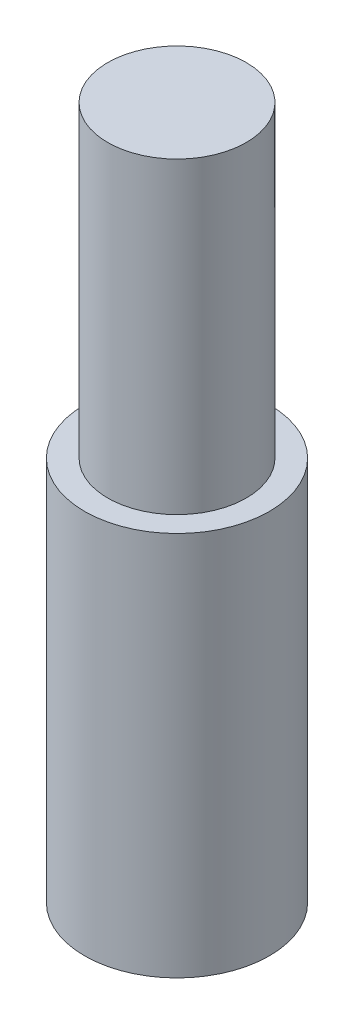
ISO-10303-21;
HEADER;
FILE_DESCRIPTION(('STEP AP214'),'2;1');
FILE_NAME('part.step','',(''),(''),'','','');
FILE_SCHEMA(('AUTOMOTIVE_DESIGN { 1 0 10303 214 1 1 1 1 }'));
ENDSEC;
DATA;
#1=APPLICATION_CONTEXT('core data for automotive mechanical design processes');
#2=APPLICATION_PROTOCOL_DEFINITION('international standard','automotive_design',2000,#1);
#3=PRODUCT_CONTEXT('',#1,'mechanical');
#4=PRODUCT('Part','Part','',(#3));
#5=PRODUCT_RELATED_PRODUCT_CATEGORY('part','',(#4));
#6=PRODUCT_DEFINITION_FORMATION('','',#4);
#7=PRODUCT_DEFINITION_CONTEXT('part definition',#1,'design');
#8=PRODUCT_DEFINITION('design','',#6,#7);
#9=PRODUCT_DEFINITION_SHAPE('','',#8);
#10=(LENGTH_UNIT() NAMED_UNIT(*) SI_UNIT(.MILLI.,.METRE.));
#11=(NAMED_UNIT(*) PLANE_ANGLE_UNIT() SI_UNIT($,.RADIAN.));
#12=(NAMED_UNIT(*) SI_UNIT($,.STERADIAN.) SOLID_ANGLE_UNIT());
#13=UNCERTAINTY_MEASURE_WITH_UNIT(LENGTH_MEASURE(1.E-05),#10,'distance_accuracy_value','');
#14=(GEOMETRIC_REPRESENTATION_CONTEXT(3) GLOBAL_UNCERTAINTY_ASSIGNED_CONTEXT((#13)) GLOBAL_UNIT_ASSIGNED_CONTEXT((#10,
#11,#12)) REPRESENTATION_CONTEXT('',''));
#15=CARTESIAN_POINT('',(0.,0.,0.));
#16=DIRECTION('',(0.,0.,1.));
#17=DIRECTION('',(1.,0.,0.));
#18=AXIS2_PLACEMENT_3D('',#15,#16,#17);
#19=CARTESIAN_POINT('',(6.00000000000001,0.,0.));
#20=DIRECTION('',(0.,-1.,0.));
#21=DIRECTION('',(0.,0.,-0.999999999999998));
#22=AXIS2_PLACEMENT_3D('',#19,#20,#21);
#23=PLANE('',#22);
#24=CARTESIAN_POINT('',(0.,0.,0.));
#25=DIRECTION('',(0.,-1.,0.));
#26=DIRECTION('',(0.,0.,-0.999999999999998));
#27=AXIS2_PLACEMENT_3D('',#24,#25,#26);
#28=CIRCLE('',#27,6.00000000000001);
#29=CARTESIAN_POINT('',(0.,0.,-6.));
#30=VERTEX_POINT('',#29);
#31=EDGE_CURVE('E10',#30,#30,#28,.T.);
#32=ORIENTED_EDGE('',*,*,#31,.T.);
#33=EDGE_LOOP('',(#32));
#34=FACE_BOUND('',#33,.T.);
#35=ADVANCED_FACE('F28',(#34),#23,.T.);
#36=CARTESIAN_POINT('',(0.,-3.34601620455266,0.));
#37=DIRECTION('',(0.,-1.,0.));
#38=DIRECTION('',(0.,0.,-0.999999999999998));
#39=AXIS2_PLACEMENT_3D('',#36,#37,#38);
#40=CYLINDRICAL_SURFACE('',#39,6.00000000000001);
#41=CARTESIAN_POINT('',(0.,25.,0.));
#42=DIRECTION('',(0.,-1.,0.));
#43=DIRECTION('',(0.,0.,-0.999999999999998));
#44=AXIS2_PLACEMENT_3D('',#41,#42,#43);
#45=CIRCLE('',#44,6.);
#46=CARTESIAN_POINT('',(0.,25.,-5.99999999999999));
#47=VERTEX_POINT('',#46);
#48=EDGE_CURVE('E34',#47,#47,#45,.T.);
#49=ORIENTED_EDGE('',*,*,#48,.T.);
#50=EDGE_LOOP('',(#49));
#51=FACE_BOUND('',#50,.T.);
#52=ORIENTED_EDGE('',*,*,#31,.F.);
#53=EDGE_LOOP('',(#52));
#54=FACE_BOUND('',#53,.T.);
#55=ADVANCED_FACE('F60',(#51,#54),#40,.T.);
#56=CARTESIAN_POINT('',(4.49999999999999,25.,0.));
#57=DIRECTION('',(0.,1.,0.));
#58=DIRECTION('',(0.,0.,0.999999999999998));
#59=AXIS2_PLACEMENT_3D('',#56,#57,#58);
#60=PLANE('',#59);
#61=CARTESIAN_POINT('',(0.,25.,0.));
#62=DIRECTION('',(0.,-1.,0.));
#63=DIRECTION('',(0.,0.,-0.999999999999998));
#64=AXIS2_PLACEMENT_3D('',#61,#62,#63);
#65=CIRCLE('',#64,4.5);
#66=CARTESIAN_POINT('',(0.,25.,-4.5));
#67=VERTEX_POINT('',#66);
#68=EDGE_CURVE('E38',#67,#67,#65,.T.);
#69=ORIENTED_EDGE('',*,*,#68,.T.);
#70=EDGE_LOOP('',(#69));
#71=FACE_BOUND('',#70,.T.);
#72=ORIENTED_EDGE('',*,*,#48,.F.);
#73=EDGE_LOOP('',(#72));
#74=FACE_BOUND('',#73,.T.);
#75=ADVANCED_FACE('F57',(#71,#74),#60,.T.);
#76=CARTESIAN_POINT('',(0.,-3.34601620455266,0.));
#77=DIRECTION('',(0.,-1.,0.));
#78=DIRECTION('',(0.,0.,-0.999999999999998));
#79=AXIS2_PLACEMENT_3D('',#76,#77,#78);
#80=CYLINDRICAL_SURFACE('',#79,4.5);
#81=CARTESIAN_POINT('',(0.,45.,0.));
#82=DIRECTION('',(0.,-1.,0.));
#83=DIRECTION('',(0.,0.,-0.999999999999998));
#84=AXIS2_PLACEMENT_3D('',#81,#82,#83);
#85=CIRCLE('',#84,4.5);
#86=CARTESIAN_POINT('',(0.,45.,-4.5));
#87=VERTEX_POINT('',#86);
#88=EDGE_CURVE('E42',#87,#87,#85,.T.);
#89=ORIENTED_EDGE('',*,*,#88,.T.);
#90=EDGE_LOOP('',(#89));
#91=FACE_BOUND('',#90,.T.);
#92=ORIENTED_EDGE('',*,*,#68,.F.);
#93=EDGE_LOOP('',(#92));
#94=FACE_BOUND('',#93,.T.);
#95=ADVANCED_FACE('F48',(#91,#94),#80,.T.);
#96=CARTESIAN_POINT('',(0.,45.,0.));
#97=DIRECTION('',(0.,1.,0.));
#98=DIRECTION('',(0.,0.,0.999999999999998));
#99=AXIS2_PLACEMENT_3D('',#96,#97,#98);
#100=PLANE('',#99);
#101=ORIENTED_EDGE('',*,*,#88,.F.);
#102=EDGE_LOOP('',(#101));
#103=FACE_BOUND('',#102,.T.);
#104=ADVANCED_FACE('F51',(#103),#100,.T.);
#105=CLOSED_SHELL('',(#35,#55,#75,#95,#104));
#106=MANIFOLD_SOLID_BREP('B2',#105);
#107=ADVANCED_BREP_SHAPE_REPRESENTATION('',(#18,#106),#14);
#108=SHAPE_DEFINITION_REPRESENTATION(#9,#107);
ENDSEC;
END-ISO-10303-21;
